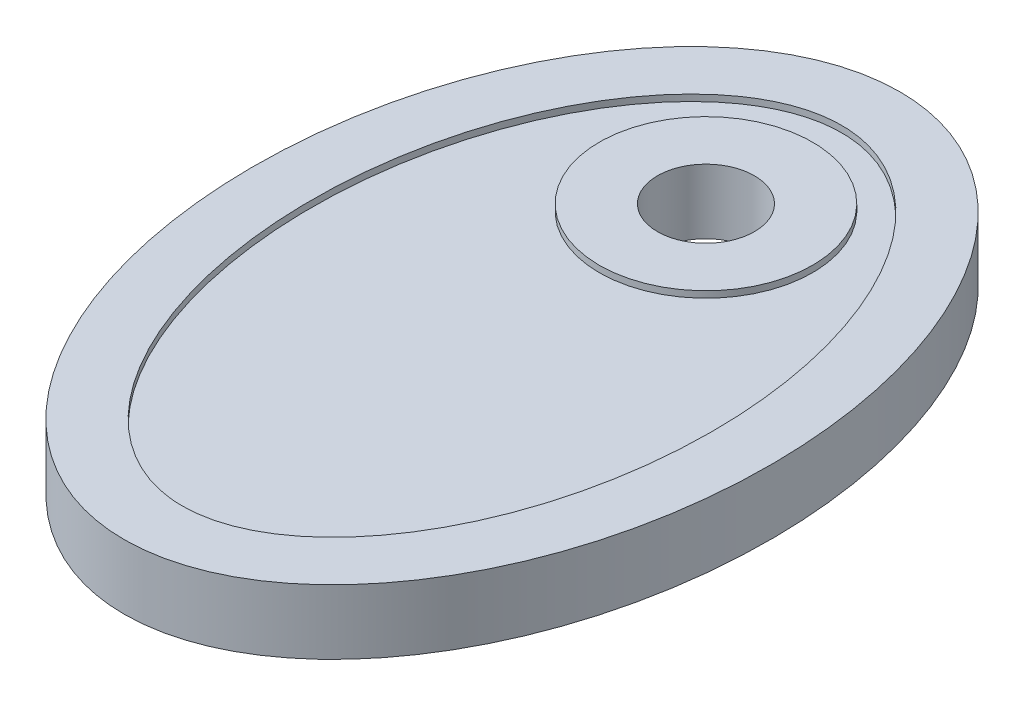
ISO-10303-21;
HEADER;
FILE_DESCRIPTION(('STEP AP214'),'2;1');
FILE_NAME('part.step','',(''),(''),'','','');
FILE_SCHEMA(('AUTOMOTIVE_DESIGN { 1 0 10303 214 1 1 1 1 }'));
ENDSEC;
DATA;
#1=APPLICATION_CONTEXT('core data for automotive mechanical design processes');
#2=APPLICATION_PROTOCOL_DEFINITION('international standard','automotive_design',2000,#1);
#3=PRODUCT_CONTEXT('',#1,'mechanical');
#4=PRODUCT('Part','Part','',(#3));
#5=PRODUCT_RELATED_PRODUCT_CATEGORY('part','',(#4));
#6=PRODUCT_DEFINITION_FORMATION('','',#4);
#7=PRODUCT_DEFINITION_CONTEXT('part definition',#1,'design');
#8=PRODUCT_DEFINITION('design','',#6,#7);
#9=PRODUCT_DEFINITION_SHAPE('','',#8);
#10=(LENGTH_UNIT() NAMED_UNIT(*) SI_UNIT(.MILLI.,.METRE.));
#11=(NAMED_UNIT(*) PLANE_ANGLE_UNIT() SI_UNIT($,.RADIAN.));
#12=(NAMED_UNIT(*) SI_UNIT($,.STERADIAN.) SOLID_ANGLE_UNIT());
#13=UNCERTAINTY_MEASURE_WITH_UNIT(LENGTH_MEASURE(1.E-05),#10,'distance_accuracy_value','');
#14=(GEOMETRIC_REPRESENTATION_CONTEXT(3) GLOBAL_UNCERTAINTY_ASSIGNED_CONTEXT((#13)) GLOBAL_UNIT_ASSIGNED_CONTEXT((#10,
#11,#12)) REPRESENTATION_CONTEXT('',''));
#15=CARTESIAN_POINT('',(0.,0.,0.));
#16=DIRECTION('',(0.,0.,1.));
#17=DIRECTION('',(1.,0.,0.));
#18=AXIS2_PLACEMENT_3D('',#15,#16,#17);
#19=CARTESIAN_POINT('',(0.,10.,0.));
#20=DIRECTION('',(0.,1.,0.));
#21=DIRECTION('',(0.,0.,1.));
#22=AXIS2_PLACEMENT_3D('',#19,#20,#21);
#23=PLANE('',#22);
#24=CARTESIAN_POINT('',(0.,10.,-30.));
#25=DIRECTION('',(0.,1.,0.));
#26=DIRECTION('',(0.,0.,1.));
#27=AXIS2_PLACEMENT_3D('',#24,#25,#26);
#28=CIRCLE('',#27,7.5);
#29=CARTESIAN_POINT('',(0.,10.,-22.5));
#30=VERTEX_POINT('',#29);
#31=EDGE_CURVE('E44',#30,#30,#28,.T.);
#32=ORIENTED_EDGE('',*,*,#31,.F.);
#33=EDGE_LOOP('',(#32));
#34=FACE_BOUND('',#33,.T.);
#35=CARTESIAN_POINT('',(0.,10.,-30.));
#36=DIRECTION('',(0.,1.,0.));
#37=DIRECTION('',(0.,0.,1.));
#38=AXIS2_PLACEMENT_3D('',#35,#36,#37);
#39=CIRCLE('',#38,16.5);
#40=CARTESIAN_POINT('',(0.,10.,-13.5));
#41=VERTEX_POINT('',#40);
#42=EDGE_CURVE('E84',#41,#41,#39,.T.);
#43=ORIENTED_EDGE('',*,*,#42,.T.);
#44=EDGE_LOOP('',(#43));
#45=FACE_BOUND('',#44,.T.);
#46=ADVANCED_FACE('F36',(#34,#45),#23,.T.);
#47=CARTESIAN_POINT('',(0.,10.,-30.));
#48=DIRECTION('',(0.,-1.,0.));
#49=DIRECTION('',(0.,0.,-1.));
#50=AXIS2_PLACEMENT_3D('',#47,#48,#49);
#51=CYLINDRICAL_SURFACE('',#50,7.5);
#52=ORIENTED_EDGE('',*,*,#31,.T.);
#53=EDGE_LOOP('',(#52));
#54=FACE_BOUND('',#53,.T.);
#55=CARTESIAN_POINT('',(0.,0.,-30.));
#56=DIRECTION('',(0.,1.,0.));
#57=DIRECTION('',(0.,0.,1.));
#58=AXIS2_PLACEMENT_3D('',#55,#56,#57);
#59=CIRCLE('',#58,7.5);
#60=CARTESIAN_POINT('',(0.,0.,-22.5));
#61=VERTEX_POINT('',#60);
#62=EDGE_CURVE('E52',#61,#61,#59,.T.);
#63=ORIENTED_EDGE('',*,*,#62,.F.);
#64=EDGE_LOOP('',(#63));
#65=FACE_BOUND('',#64,.T.);
#66=ADVANCED_FACE('F38',(#54,#65),#51,.F.);
#67=CARTESIAN_POINT('',(0.,10.,0.));
#68=DIRECTION('',(0.,1.,0.));
#69=DIRECTION('',(0.,0.,-1.));
#70=AXIS2_PLACEMENT_3D('',#67,#68,#69);
#71=ELLIPSE('',#70,60.,40.);
#72=DIRECTION('',(0.,-1.,0.));
#73=VECTOR('',#72,1.);
#74=SURFACE_OF_LINEAR_EXTRUSION('',#71,#73);
#75=CARTESIAN_POINT('',(0.,10.,-60.));
#76=VERTEX_POINT('',#75);
#77=EDGE_CURVE('E10',#76,#76,#71,.T.);
#78=ORIENTED_EDGE('',*,*,#77,.F.);
#79=EDGE_LOOP('',(#78));
#80=FACE_BOUND('',#79,.T.);
#81=CARTESIAN_POINT('',(0.,0.,0.));
#82=DIRECTION('',(0.,1.,0.));
#83=DIRECTION('',(0.,0.,-1.));
#84=AXIS2_PLACEMENT_3D('',#81,#82,#83);
#85=ELLIPSE('',#84,60.,40.);
#86=CARTESIAN_POINT('',(0.,0.,-60.));
#87=VERTEX_POINT('',#86);
#88=EDGE_CURVE('E40',#87,#87,#85,.T.);
#89=ORIENTED_EDGE('',*,*,#88,.T.);
#90=EDGE_LOOP('',(#89));
#91=FACE_BOUND('',#90,.T.);
#92=ADVANCED_FACE('F53',(#80,#91),#74,.F.);
#93=CARTESIAN_POINT('',(0.,10.,51.));
#94=CARTESIAN_POINT('',(0.363331942572548,10.,50.9999993472928));
#95=CARTESIAN_POINT('',(0.72667185661985,10.,50.9887785571514));
#96=CARTESIAN_POINT('',(1.45210004218176,10.,50.9440359100779));
#97=CARTESIAN_POINT('',(1.81418780996727,10.,50.9105059371893));
#98=CARTESIAN_POINT('',(2.53566862494331,10.,50.8215747320704));
#99=CARTESIAN_POINT('',(2.89506161295472,10.,50.7661730209477));
#100=CARTESIAN_POINT('',(3.61047862296689,10.,50.6340883392831));
#101=CARTESIAN_POINT('',(3.96649655070765,10.,50.5573724738923));
#102=CARTESIAN_POINT('',(4.67351232782389,10.,50.3835928276542));
#103=CARTESIAN_POINT('',(5.0245103352103,10.,50.286529688786));
#104=CARTESIAN_POINT('',(5.72056992262585,10.,50.0731081270343));
#105=CARTESIAN_POINT('',(6.0656311426587,10.,49.956748538568));
#106=CARTESIAN_POINT('',(7.03100448491029,10.,49.6023364137692));
#107=CARTESIAN_POINT('',(7.64363078343208,10.,49.3430630558093));
#108=CARTESIAN_POINT('',(8.84329116384838,10.,48.7711178583314));
#109=CARTESIAN_POINT('',(9.43031901453351,10.,48.4584331074183));
#110=CARTESIAN_POINT('',(10.5777374825332,10.,47.7861474631697));
#111=CARTESIAN_POINT('',(11.1380939210909,10.,47.4264884707071));
#112=CARTESIAN_POINT('',(12.2306187328155,10.,46.6668476638044));
#113=CARTESIAN_POINT('',(12.7627854631189,10.,46.2668635031954));
#114=CARTESIAN_POINT('',(14.0479675888981,10.,45.231420987286));
#115=CARTESIAN_POINT('',(14.7842614197669,10.,44.5751516631253));
#116=CARTESIAN_POINT('',(16.1968127572353,10.,43.2009115931968));
#117=CARTESIAN_POINT('',(16.873041804546,10.,42.4829119126975));
#118=CARTESIAN_POINT('',(18.1688024124558,10.,40.995824047029));
#119=CARTESIAN_POINT('',(18.788248790744,10.,40.2266619997508));
#120=CARTESIAN_POINT('',(19.9721569832936,10.,38.6473878786163));
#121=CARTESIAN_POINT('',(20.5366206161316,10.,37.837277160501));
#122=CARTESIAN_POINT('',(21.6406134525096,10.,36.1415722525619));
#123=CARTESIAN_POINT('',(22.1774510158127,10.,35.2542315910504));
#124=CARTESIAN_POINT('',(23.1969480930636,10.,33.4485305742953));
#125=CARTESIAN_POINT('',(23.6795815903968,10.,32.5301555961199));
#126=CARTESIAN_POINT('',(24.5932000691607,10.,30.6679756587652));
#127=CARTESIAN_POINT('',(25.0241771000918,10.,29.7241668123432));
#128=CARTESIAN_POINT('',(25.8373058869897,10.,27.8144376385049));
#129=CARTESIAN_POINT('',(26.2193966747139,10.,26.8484914382954));
#130=CARTESIAN_POINT('',(26.9361443908843,10.,24.8994378256087));
#131=CARTESIAN_POINT('',(27.2708115485805,10.,23.9163341655276));
#132=CARTESIAN_POINT('',(27.8946047335904,10.,21.935755585814));
#133=CARTESIAN_POINT('',(28.1837267994326,10.,20.9382794243008));
#134=CARTESIAN_POINT('',(28.8233647370208,10.,18.5354957094464));
#135=CARTESIAN_POINT('',(29.1530704336629,10.,17.124613230959));
#136=CARTESIAN_POINT('',(29.7300892901053,10.,14.2857662601995));
#137=CARTESIAN_POINT('',(29.9773757808812,10.,12.8577963933583));
#138=CARTESIAN_POINT('',(30.3918096156627,10.,9.99007688766845));
#139=CARTESIAN_POINT('',(30.5589443780295,10.,8.55032543548398));
#140=CARTESIAN_POINT('',(30.8148200588801,10.,5.66104971716649));
#141=CARTESIAN_POINT('',(30.9034060600109,10.,4.21151179479756));
#142=CARTESIAN_POINT('',(31.0024314418822,10.,1.31003393115168));
#143=CARTESIAN_POINT('',(31.0128845870751,10.,-0.141905541969763));
#144=CARTESIAN_POINT('',(30.9557777705272,10.,-3.04416572261065));
#145=CARTESIAN_POINT('',(30.8882224849586,10.,-4.49448652194429));
#146=CARTESIAN_POINT('',(30.6730339477902,10.,-7.40901534728054));
#147=CARTESIAN_POINT('',(30.5243255357497,10.,-8.87314444673375));
#148=CARTESIAN_POINT('',(30.1446951529756,10.,-11.790895039838));
#149=CARTESIAN_POINT('',(29.9137649463056,10.,-13.2445154659755));
#150=CARTESIAN_POINT('',(29.3673166763212,10.,-16.136518909521));
#151=CARTESIAN_POINT('',(29.0517613974943,10.,-17.5748949329126));
#152=CARTESIAN_POINT('',(28.3343246429404,10.,-20.4242040084431));
#153=CARTESIAN_POINT('',(27.9327757831459,10.,-21.8352205774013));
#154=CARTESIAN_POINT('',(27.038614511015,10.,-24.6278497669017));
#155=CARTESIAN_POINT('',(26.5460357363625,10.,-26.0094730393395));
#156=CARTESIAN_POINT('',(25.735207822477,10.,-28.0524775766029));
#157=CARTESIAN_POINT('',(25.4530552418181,10.,-28.7283314907416));
#158=CARTESIAN_POINT('',(24.8639156583644,10.,-30.0691084561957));
#159=CARTESIAN_POINT('',(24.5569301183144,10.,-30.734032148566));
#160=CARTESIAN_POINT('',(23.7945912309787,10.,-32.3040831228001));
#161=CARTESIAN_POINT('',(23.3274845196538,10.,-33.2035470795208));
#162=CARTESIAN_POINT('',(22.3416162916778,10.,-34.9736741814713));
#163=CARTESIAN_POINT('',(21.8228600659894,10.,-35.8443402645994));
#164=CARTESIAN_POINT('',(20.7309434498334,10.,-37.5507261140679));
#165=CARTESIAN_POINT('',(20.1577956451536,10.,-38.3864539006966));
#166=CARTESIAN_POINT('',(18.9539877045298,10.,-40.0154963989566));
#167=CARTESIAN_POINT('',(18.3233367862932,10.,-40.8088178760611));
#168=CARTESIAN_POINT('',(17.1293110547041,10.,-42.1949003071544));
#169=CARTESIAN_POINT('',(16.5765225640521,10.,-42.7967712434432));
#170=CARTESIAN_POINT('',(15.4299297456675,10.,-43.9603371488574));
#171=CARTESIAN_POINT('',(14.8361231159492,10.,-44.5220298595274));
#172=CARTESIAN_POINT('',(13.607051838476,10.,-45.5968005170026));
#173=CARTESIAN_POINT('',(12.971844246316,10.,-46.1099430755861));
#174=CARTESIAN_POINT('',(11.9875254443612,10.,-46.8364560728483));
#175=CARTESIAN_POINT('',(11.6542137793198,10.,-47.0713989143906));
#176=CARTESIAN_POINT('',(10.9769815895992,10.,-47.5256772473742));
#177=CARTESIAN_POINT('',(10.6330586329556,10.,-47.7450091223281));
#178=CARTESIAN_POINT('',(9.79700694321435,10.,-48.2497764954778));
#179=CARTESIAN_POINT('',(9.29995808512551,10.,-48.5271358884026));
#180=CARTESIAN_POINT('',(8.28677831997349,10.,-49.0442354258324));
#181=CARTESIAN_POINT('',(7.77065311929716,10.,-49.2839867094606));
#182=CARTESIAN_POINT('',(6.72127462084253,10.,-49.7213211689836));
#183=CARTESIAN_POINT('',(6.18803647298591,10.,-49.9189405202722));
#184=CARTESIAN_POINT('',(5.10645364533738,10.,-50.2678487180929));
#185=CARTESIAN_POINT('',(4.55810890720509,10.,-50.4191373856725));
#186=CARTESIAN_POINT('',(3.63132126324471,10.,-50.6301277865288));
#187=CARTESIAN_POINT('',(3.25596933801539,10.,-50.7036007188103));
#188=CARTESIAN_POINT('',(2.50134011463263,10.,-50.8268301092898));
#189=CARTESIAN_POINT('',(2.12206265258086,10.,-50.8765855731256));
#190=CARTESIAN_POINT('',(1.36111158428026,10.,-50.951660202295));
#191=CARTESIAN_POINT('',(0.979438086831125,10.,-50.9769804692238));
#192=CARTESIAN_POINT('',(0.215367896801231,10.,-51.0028172582333));
#193=CARTESIAN_POINT('',(-0.16702853417828,10.,-51.0033414859383));
#194=CARTESIAN_POINT('',(-0.931069827349889,10.,-50.979594357692));
#195=CARTESIAN_POINT('',(-1.31271465374765,10.,-50.9553218481288));
#196=CARTESIAN_POINT('',(-2.07358636777429,10.,-50.8823481958708));
#197=CARTESIAN_POINT('',(-2.4528135639682,10.,-50.833650236504));
#198=CARTESIAN_POINT('',(-3.32726958068449,10.,-50.6932574388235));
#199=CARTESIAN_POINT('',(-3.82111402982957,10.,-50.5928214652584));
#200=CARTESIAN_POINT('',(-4.79910272761887,10.,-50.3530029510269));
#201=CARTESIAN_POINT('',(-5.28324811870489,10.,-50.2136250265436));
#202=CARTESIAN_POINT('',(-6.23983655733434,10.,-49.8986571713203));
#203=CARTESIAN_POINT('',(-6.71227372290285,10.,-49.7230494366029));
#204=CARTESIAN_POINT('',(-7.64348258349103,10.,-49.3387344705799));
#205=CARTESIAN_POINT('',(-8.10225198280094,10.,-49.1300217155989));
#206=CARTESIAN_POINT('',(-9.21972378889298,10.,-48.5761065493043));
#207=CARTESIAN_POINT('',(-9.86969981998974,10.,-48.2132108003973));
#208=CARTESIAN_POINT('',(-11.1351125778756,10.,-47.4315116595368));
#209=CARTESIAN_POINT('',(-11.7505349418453,10.,-47.0126852598848));
#210=CARTESIAN_POINT('',(-12.947209232884,10.,-46.1267399566486));
#211=CARTESIAN_POINT('',(-13.5283943260411,10.,-45.6595312079359));
#212=CARTESIAN_POINT('',(-14.6556163461017,10.,-44.6846830561176));
#213=CARTESIAN_POINT('',(-15.2016532520394,10.,-44.1770436288954));
#214=CARTESIAN_POINT('',(-16.2714516970148,10.,-43.1154338534188));
#215=CARTESIAN_POINT('',(-16.7944262838627,10.,-42.5606734074284));
#216=CARTESIAN_POINT('',(-17.805940422262,10.,-41.4202606647794));
#217=CARTESIAN_POINT('',(-18.2944640629099,10.,-40.8345943099538));
#218=CARTESIAN_POINT('',(-19.2382048536272,10.,-39.6369590850471));
#219=CARTESIAN_POINT('',(-19.6934172280392,10.,-39.0249864634638));
#220=CARTESIAN_POINT('',(-20.5724622434377,10.,-37.7775679010778));
#221=CARTESIAN_POINT('',(-20.9962458649392,10.,-37.1420875163101));
#222=CARTESIAN_POINT('',(-21.812876974485,10.,-35.8517783796921));
#223=CARTESIAN_POINT('',(-22.2057309351078,10.,-35.1969537156305));
#224=CARTESIAN_POINT('',(-22.9618318630695,10.,-33.8704176993162));
#225=CARTESIAN_POINT('',(-23.3250762700109,10.,-33.1987048932694));
#226=CARTESIAN_POINT('',(-24.2164145504303,10.,-31.4644723174615));
#227=CARTESIAN_POINT('',(-24.7243801769513,10.,-30.3915592816379));
#228=CARTESIAN_POINT('',(-25.6754072076747,10.,-28.2169595697744));
#229=CARTESIAN_POINT('',(-26.1184385082247,10.,-27.115259825291));
#230=CARTESIAN_POINT('',(-26.9426060955216,10.,-24.8887890626142));
#231=CARTESIAN_POINT('',(-27.3237314358728,10.,-23.7640140036917));
#232=CARTESIAN_POINT('',(-28.0268960632185,10.,-21.4952842188249));
#233=CARTESIAN_POINT('',(-28.3488904342569,10.,-20.3513156273848));
#234=CARTESIAN_POINT('',(-28.9355507436623,10.,-18.0490846351105));
#235=CARTESIAN_POINT('',(-29.2002299012277,10.,-16.8908255955078));
#236=CARTESIAN_POINT('',(-29.6740687689371,10.,-14.5631162778503));
#237=CARTESIAN_POINT('',(-29.8832296047148,10.,-13.3936662271914));
#238=CARTESIAN_POINT('',(-30.3502634739202,10.,-10.3834755233569));
#239=CARTESIAN_POINT('',(-30.5689578922717,10.,-8.5365365540388));
#240=CARTESIAN_POINT('',(-30.8771840635331,10.,-4.83197086294974));
#241=CARTESIAN_POINT('',(-30.9667054030674,10.,-2.97434329162818));
#242=CARTESIAN_POINT('',(-31.0179266385518,10.,0.743053428649654));
#243=CARTESIAN_POINT('',(-30.9795998373578,10.,2.60282294382357));
#244=CARTESIAN_POINT('',(-30.7744819803157,10.,6.3153048570326));
#245=CARTESIAN_POINT('',(-30.6076998687877,10.,8.16801773739396));
#246=CARTESIAN_POINT('',(-30.2231034830499,10.,11.2219543200852));
#247=CARTESIAN_POINT('',(-30.0425969142509,10.,12.4279863322839));
#248=CARTESIAN_POINT('',(-29.6239841336532,10.,14.8301352739046));
#249=CARTESIAN_POINT('',(-29.3858760218547,10.,16.0262518749183));
#250=CARTESIAN_POINT('',(-28.8503919778835,10.,18.4054698174184));
#251=CARTESIAN_POINT('',(-28.5530021012607,10.,19.5885680274551));
#252=CARTESIAN_POINT('',(-27.8973832275134,10.,21.9359856670917));
#253=CARTESIAN_POINT('',(-27.5392438358566,10.,23.1003300281769));
#254=CARTESIAN_POINT('',(-26.759324691918,10.,25.4073394548355));
#255=CARTESIAN_POINT('',(-26.3375568074402,10.,26.550008518575));
#256=CARTESIAN_POINT('',(-25.4274151749414,10.,28.8079891817891));
#257=CARTESIAN_POINT('',(-24.9390745202342,10.,29.9233140510784));
#258=CARTESIAN_POINT('',(-23.9520634515701,10.,31.9942641142835));
#259=CARTESIAN_POINT('',(-23.4610218828995,10.,32.9535183072326));
#260=CARTESIAN_POINT('',(-22.4207220003277,10.,34.840004275695));
#261=CARTESIAN_POINT('',(-21.871465293396,10.,35.767236934194));
#262=CARTESIAN_POINT('',(-20.7116783133223,10.,37.581949339956));
#263=CARTESIAN_POINT('',(-20.1011933435269,10.,38.469457786485));
#264=CARTESIAN_POINT('',(-19.1367643289502,10.,39.7641624219377));
#265=CARTESIAN_POINT('',(-18.8071825544881,10.,40.189624408691));
#266=CARTESIAN_POINT('',(-18.1312711828154,10.,41.0270167949873));
#267=CARTESIAN_POINT('',(-17.7849421292975,10.,41.4389476330847));
#268=CARTESIAN_POINT('',(-16.9105618449079,10.,42.4351389415809));
#269=CARTESIAN_POINT('',(-16.3726418352262,10.,43.0108431457224));
#270=CARTESIAN_POINT('',(-15.537255206338,10.,43.8456532033587));
#271=CARTESIAN_POINT('',(-15.254042523676,10.,44.1191316329407));
#272=CARTESIAN_POINT('',(-14.6778272457558,10.,44.6557986146888));
#273=CARTESIAN_POINT('',(-14.3848209503191,10.,44.9189831942853));
#274=CARTESIAN_POINT('',(-13.491829701015,10.,45.690930776633));
#275=CARTESIAN_POINT('',(-12.8770973296555,10.,46.182867802951));
#276=CARTESIAN_POINT('',(-11.6082372969767,10.,47.1130467538648));
#277=CARTESIAN_POINT('',(-10.9541195710931,10.,47.5513021363664));
#278=CARTESIAN_POINT('',(-9.79096277581307,10.,48.2533276535769));
#279=CARTESIAN_POINT('',(-9.29096497667715,10.,48.5321009418149));
#280=CARTESIAN_POINT('',(-8.27148920441843,10.,49.0516544897923));
#281=CARTESIAN_POINT('',(-7.75201162657699,10.,49.2924355199502));
#282=CARTESIAN_POINT('',(-6.69640707623667,10.,49.7309774612206));
#283=CARTESIAN_POINT('',(-6.16031704611177,10.,49.928826955781));
#284=CARTESIAN_POINT('',(-5.07313172634405,10.,50.277600160746));
#285=CARTESIAN_POINT('',(-4.52204229227905,10.,50.4285419054934));
#286=CARTESIAN_POINT('',(-3.64025778718893,10.,50.6273271854043));
#287=CARTESIAN_POINT('',(-3.31326685332761,10.,50.6919364196601));
#288=CARTESIAN_POINT('',(-2.65625784703452,10.,50.8031972892926));
#289=CARTESIAN_POINT('',(-2.32624017626918,10.,50.8498512731229));
#290=CARTESIAN_POINT('',(-1.6640253077511,10.,50.9247171454666));
#291=CARTESIAN_POINT('',(-1.33182752439415,10.,50.9529238553314));
#292=CARTESIAN_POINT('',(-0.666421950542,10.,50.9905641017271));
#293=CARTESIAN_POINT('',(-0.333214327617119,10.,51.0000005986024));
#294=CARTESIAN_POINT('',(0.,10.,51.));
#295=B_SPLINE_CURVE_WITH_KNOTS('',3,(#93,#94,#95,#96,#97,#98,#99,#100,#101,#102,#103,#104,#105,
#106,#107,#108,#109,#110,#111,#112,#113,#114,#115,#116,#117,#118,#119,#120,#121,#122,#123,#124,
#125,#126,#127,#128,#129,#130,#131,#132,#133,#134,#135,#136,#137,#138,#139,#140,#141,#142,#143,
#144,#145,#146,#147,#148,#149,#150,#151,#152,#153,#154,#155,#156,#157,#158,#159,#160,#161,#162,
#163,#164,#165,#166,#167,#168,#169,#170,#171,#172,#173,#174,#175,#176,#177,#178,#179,#180,#181,
#182,#183,#184,#185,#186,#187,#188,#189,#190,#191,#192,#193,#194,#195,#196,#197,#198,#199,#200,
#201,#202,#203,#204,#205,#206,#207,#208,#209,#210,#211,#212,#213,#214,#215,#216,#217,#218,#219,
#220,#221,#222,#223,#224,#225,#226,#227,#228,#229,#230,#231,#232,#233,#234,#235,#236,#237,#238,
#239,#240,#241,#242,#243,#244,#245,#246,#247,#248,#249,#250,#251,#252,#253,#254,#255,#256,#257,
#258,#259,#260,#261,#262,#263,#264,#265,#266,#267,#268,#269,#270,#271,#272,#273,#274,#275,#276,
#277,#278,#279,#280,#281,#282,#283,#284,#285,#286,#287,#288,#289,#290,#291,#292,#293,#294),
.UNSPECIFIED.,.T.,.F.,(4,2,2,2,2,2,2,2,2,2,2,2,2,2,2,2,2,2,2,2,2,2,2,2,2,2,2,2,2,2,2,2,2,2,2,2,
2,2,2,2,2,2,2,2,2,2,2,2,2,2,2,2,2,2,2,2,2,2,2,2,2,2,2,2,2,2,2,2,2,2,2,2,2,2,2,2,2,2,2,2,2,2,2,2,
2,2,2,2,2,2,2,2,2,2,2,2,2,2,2,2,4),(0.,1.08983767183651,2.18007203748872,3.27033027568293,
4.36228058333842,5.45419644393048,6.54617828465185,8.53871280866407,10.5317296811245,
12.5272353415096,14.5228571699939,17.4771867969358,20.4329088296322,23.3929946967083,
26.3529826244782,29.4621943455425,32.5728920906377,35.6840679932835,38.7990869272313,
41.9134329272459,45.028049660911,49.3720156233086,53.7173858350673,58.0634379285423,
62.4180425550636,66.7718800246639,71.1254565194398,75.538163483724,79.9513125814274,
84.3664056384301,88.7647203582244,93.1614130358944,95.3581482884265,97.5547542399483,
100.593673713334,103.632282200279,106.670189283349,109.707610245372,112.157440448821,
114.607408251462,117.054068309797,118.277077172051,119.500368444507,121.206468912328,
122.912063093214,124.616186862759,126.320317214411,127.467062194713,128.613855248421,
129.760596599632,130.906981586828,132.053419909406,133.199708857407,134.709819739523,
136.219751688827,137.730427420731,139.241355479237,141.471155628981,143.701875873814,
145.936815445889,148.171756351096,150.457427280925,152.744147009105,155.031193932336,
157.321736051574,159.611797553192,161.902056871411,165.460824202531,169.021236200195,
172.582277076747,176.146011835454,179.70892377577,183.271763472548,188.84630905264,
194.421304003411,199.997463192934,205.573234150598,209.230391266394,212.887669030789,
216.545808089292,220.198597583887,223.850706611065,227.501006750788,230.732040001994,
233.962984087038,237.19155496071,238.805735591655,240.419863854113,242.78163969922,
243.962522624892,245.143856864854,247.503234402175,249.862019231279,251.578003121687,
253.293952210376,255.00632627214,256.718041170851,257.717547124316,258.716922303126,
259.716577913288,260.716075850248),.UNSPECIFIED.);
#296=CARTESIAN_POINT('',(0.,10.,51.));
#297=VERTEX_POINT('',#296);
#298=EDGE_CURVE('E88',#297,#297,#295,.T.);
#299=ORIENTED_EDGE('',*,*,#298,.F.);
#300=EDGE_LOOP('',(#299));
#301=FACE_BOUND('',#300,.T.);
#302=ORIENTED_EDGE('',*,*,#77,.T.);
#303=EDGE_LOOP('',(#302));
#304=FACE_BOUND('',#303,.T.);
#305=ADVANCED_FACE('F56',(#301,#304),#23,.T.);
#306=CARTESIAN_POINT('',(0.,0.,0.));
#307=DIRECTION('',(0.,1.,0.));
#308=DIRECTION('',(0.,0.,1.));
#309=AXIS2_PLACEMENT_3D('',#306,#307,#308);
#310=PLANE('',#309);
#311=ORIENTED_EDGE('',*,*,#62,.T.);
#312=EDGE_LOOP('',(#311));
#313=FACE_BOUND('',#312,.T.);
#314=ORIENTED_EDGE('',*,*,#88,.F.);
#315=EDGE_LOOP('',(#314));
#316=FACE_BOUND('',#315,.T.);
#317=ADVANCED_FACE('F58',(#313,#316),#310,.F.);
#318=CARTESIAN_POINT('',(0.,10.,-30.));
#319=DIRECTION('',(0.,-1.,0.));
#320=DIRECTION('',(0.,0.,-1.));
#321=AXIS2_PLACEMENT_3D('',#318,#319,#320);
#322=CYLINDRICAL_SURFACE('',#321,16.5);
#323=ORIENTED_EDGE('',*,*,#42,.F.);
#324=EDGE_LOOP('',(#323));
#325=FACE_BOUND('',#324,.T.);
#326=CARTESIAN_POINT('',(0.,9.,-30.));
#327=DIRECTION('',(0.,1.,0.));
#328=DIRECTION('',(0.,0.,1.));
#329=AXIS2_PLACEMENT_3D('',#326,#327,#328);
#330=CIRCLE('',#329,16.5);
#331=CARTESIAN_POINT('',(0.,9.,-13.5));
#332=VERTEX_POINT('',#331);
#333=EDGE_CURVE('E85',#332,#332,#330,.T.);
#334=ORIENTED_EDGE('',*,*,#333,.T.);
#335=EDGE_LOOP('',(#334));
#336=FACE_BOUND('',#335,.T.);
#337=ADVANCED_FACE('F61',(#325,#336),#322,.T.);
#338=CARTESIAN_POINT('',(0.,10.,0.));
#339=DIRECTION('',(0.,1.,0.));
#340=DIRECTION('',(0.,0.,-1.));
#341=AXIS2_PLACEMENT_3D('',#338,#339,#340);
#342=ELLIPSE('',#341,60.,40.);
#343=DIRECTION('',(0.,-1.,0.));
#344=VECTOR('',#343,1.);
#345=SURFACE_OF_LINEAR_EXTRUSION('',#342,#344);
#346=OFFSET_SURFACE('',#345,9.,.F.);
#347=ORIENTED_EDGE('',*,*,#298,.T.);
#348=EDGE_LOOP('',(#347));
#349=FACE_BOUND('',#348,.T.);
#350=CARTESIAN_POINT('',(0.,9.,51.));
#351=CARTESIAN_POINT('',(0.363331942572548,9.,50.9999993472928));
#352=CARTESIAN_POINT('',(0.72667185661985,9.,50.9887785571514));
#353=CARTESIAN_POINT('',(1.45210004218176,9.,50.9440359100779));
#354=CARTESIAN_POINT('',(1.81418780996727,9.,50.9105059371893));
#355=CARTESIAN_POINT('',(2.53566862494331,9.,50.8215747320704));
#356=CARTESIAN_POINT('',(2.89506161295472,9.,50.7661730209477));
#357=CARTESIAN_POINT('',(3.61047862296689,9.,50.6340883392831));
#358=CARTESIAN_POINT('',(3.96649655070765,9.,50.5573724738923));
#359=CARTESIAN_POINT('',(4.67351232782389,9.,50.3835928276542));
#360=CARTESIAN_POINT('',(5.0245103352103,9.,50.286529688786));
#361=CARTESIAN_POINT('',(5.72056992262585,9.,50.0731081270343));
#362=CARTESIAN_POINT('',(6.0656311426587,9.,49.956748538568));
#363=CARTESIAN_POINT('',(7.03100448491029,9.,49.6023364137692));
#364=CARTESIAN_POINT('',(7.64363078343208,9.,49.3430630558093));
#365=CARTESIAN_POINT('',(8.84329116384838,9.,48.7711178583314));
#366=CARTESIAN_POINT('',(9.43031901453351,9.,48.4584331074183));
#367=CARTESIAN_POINT('',(10.5777374825332,9.,47.7861474631697));
#368=CARTESIAN_POINT('',(11.1380939210909,9.,47.4264884707071));
#369=CARTESIAN_POINT('',(12.2306187328155,9.,46.6668476638044));
#370=CARTESIAN_POINT('',(12.7627854631189,9.,46.2668635031954));
#371=CARTESIAN_POINT('',(14.0479675888981,9.,45.231420987286));
#372=CARTESIAN_POINT('',(14.7842614197669,9.,44.5751516631253));
#373=CARTESIAN_POINT('',(16.1968127572353,9.,43.2009115931968));
#374=CARTESIAN_POINT('',(16.873041804546,9.,42.4829119126975));
#375=CARTESIAN_POINT('',(18.1688024124558,9.,40.995824047029));
#376=CARTESIAN_POINT('',(18.788248790744,9.,40.2266619997508));
#377=CARTESIAN_POINT('',(19.9721569832936,9.,38.6473878786163));
#378=CARTESIAN_POINT('',(20.5366206161316,9.,37.837277160501));
#379=CARTESIAN_POINT('',(21.6406134525096,9.,36.1415722525619));
#380=CARTESIAN_POINT('',(22.1774510158127,9.,35.2542315910504));
#381=CARTESIAN_POINT('',(23.1969480930636,9.,33.4485305742953));
#382=CARTESIAN_POINT('',(23.6795815903968,9.,32.5301555961199));
#383=CARTESIAN_POINT('',(24.5932000691607,9.,30.6679756587652));
#384=CARTESIAN_POINT('',(25.0241771000918,9.,29.7241668123432));
#385=CARTESIAN_POINT('',(25.8373058869897,9.,27.8144376385049));
#386=CARTESIAN_POINT('',(26.2193966747139,9.,26.8484914382954));
#387=CARTESIAN_POINT('',(26.9361443908843,9.,24.8994378256087));
#388=CARTESIAN_POINT('',(27.2708115485805,9.,23.9163341655276));
#389=CARTESIAN_POINT('',(27.8946047335904,9.,21.935755585814));
#390=CARTESIAN_POINT('',(28.1837267994326,9.,20.9382794243008));
#391=CARTESIAN_POINT('',(28.8233647370208,9.,18.5354957094464));
#392=CARTESIAN_POINT('',(29.1530704336629,9.,17.124613230959));
#393=CARTESIAN_POINT('',(29.7300892901053,9.,14.2857662601995));
#394=CARTESIAN_POINT('',(29.9773757808812,9.,12.8577963933583));
#395=CARTESIAN_POINT('',(30.3918096156627,9.,9.99007688766845));
#396=CARTESIAN_POINT('',(30.5589443780295,9.,8.55032543548398));
#397=CARTESIAN_POINT('',(30.8148200588801,9.,5.66104971716649));
#398=CARTESIAN_POINT('',(30.9034060600109,9.,4.21151179479756));
#399=CARTESIAN_POINT('',(31.0024314418822,9.,1.31003393115168));
#400=CARTESIAN_POINT('',(31.0128845870751,9.,-0.141905541969763));
#401=CARTESIAN_POINT('',(30.9557777705272,9.,-3.04416572261065));
#402=CARTESIAN_POINT('',(30.8882224849586,9.,-4.49448652194429));
#403=CARTESIAN_POINT('',(30.6730339477902,9.,-7.40901534728054));
#404=CARTESIAN_POINT('',(30.5243255357497,9.,-8.87314444673375));
#405=CARTESIAN_POINT('',(30.1446951529756,9.,-11.790895039838));
#406=CARTESIAN_POINT('',(29.9137649463056,9.,-13.2445154659755));
#407=CARTESIAN_POINT('',(29.3673166763212,9.,-16.136518909521));
#408=CARTESIAN_POINT('',(29.0517613974943,9.,-17.5748949329126));
#409=CARTESIAN_POINT('',(28.3343246429404,9.,-20.4242040084431));
#410=CARTESIAN_POINT('',(27.9327757831459,9.,-21.8352205774013));
#411=CARTESIAN_POINT('',(27.038614511015,9.,-24.6278497669017));
#412=CARTESIAN_POINT('',(26.5460357363625,9.,-26.0094730393395));
#413=CARTESIAN_POINT('',(25.735207822477,9.,-28.0524775766029));
#414=CARTESIAN_POINT('',(25.4530552418181,9.,-28.7283314907416));
#415=CARTESIAN_POINT('',(24.8639156583644,9.,-30.0691084561957));
#416=CARTESIAN_POINT('',(24.5569301183144,9.,-30.734032148566));
#417=CARTESIAN_POINT('',(23.7945912309787,9.,-32.3040831228001));
#418=CARTESIAN_POINT('',(23.3274845196538,9.,-33.2035470795208));
#419=CARTESIAN_POINT('',(22.3416162916778,9.,-34.9736741814713));
#420=CARTESIAN_POINT('',(21.8228600659894,9.,-35.8443402645994));
#421=CARTESIAN_POINT('',(20.7309434498334,9.,-37.5507261140679));
#422=CARTESIAN_POINT('',(20.1577956451536,9.,-38.3864539006966));
#423=CARTESIAN_POINT('',(18.9539877045298,9.,-40.0154963989566));
#424=CARTESIAN_POINT('',(18.3233367862932,9.,-40.8088178760611));
#425=CARTESIAN_POINT('',(17.1293110547041,9.,-42.1949003071544));
#426=CARTESIAN_POINT('',(16.5765225640521,9.,-42.7967712434432));
#427=CARTESIAN_POINT('',(15.4299297456675,9.,-43.9603371488574));
#428=CARTESIAN_POINT('',(14.8361231159492,9.,-44.5220298595274));
#429=CARTESIAN_POINT('',(13.607051838476,9.,-45.5968005170026));
#430=CARTESIAN_POINT('',(12.971844246316,9.,-46.1099430755861));
#431=CARTESIAN_POINT('',(11.9875254443612,9.,-46.8364560728483));
#432=CARTESIAN_POINT('',(11.6542137793198,9.,-47.0713989143906));
#433=CARTESIAN_POINT('',(10.9769815895992,9.,-47.5256772473742));
#434=CARTESIAN_POINT('',(10.6330586329556,9.,-47.7450091223281));
#435=CARTESIAN_POINT('',(9.79700694321435,9.,-48.2497764954778));
#436=CARTESIAN_POINT('',(9.29995808512551,9.,-48.5271358884026));
#437=CARTESIAN_POINT('',(8.28677831997349,9.,-49.0442354258324));
#438=CARTESIAN_POINT('',(7.77065311929716,9.,-49.2839867094606));
#439=CARTESIAN_POINT('',(6.72127462084253,9.,-49.7213211689836));
#440=CARTESIAN_POINT('',(6.18803647298591,9.,-49.9189405202722));
#441=CARTESIAN_POINT('',(5.10645364533738,9.,-50.2678487180929));
#442=CARTESIAN_POINT('',(4.55810890720509,9.,-50.4191373856725));
#443=CARTESIAN_POINT('',(3.63132126324471,9.,-50.6301277865288));
#444=CARTESIAN_POINT('',(3.25596933801539,9.,-50.7036007188103));
#445=CARTESIAN_POINT('',(2.50134011463263,9.,-50.8268301092898));
#446=CARTESIAN_POINT('',(2.12206265258086,9.,-50.8765855731256));
#447=CARTESIAN_POINT('',(1.36111158428026,9.,-50.951660202295));
#448=CARTESIAN_POINT('',(0.979438086831125,9.,-50.9769804692238));
#449=CARTESIAN_POINT('',(0.215367896801231,9.,-51.0028172582333));
#450=CARTESIAN_POINT('',(-0.16702853417828,9.,-51.0033414859383));
#451=CARTESIAN_POINT('',(-0.931069827349889,9.,-50.979594357692));
#452=CARTESIAN_POINT('',(-1.31271465374765,9.,-50.9553218481288));
#453=CARTESIAN_POINT('',(-2.07358636777429,9.,-50.8823481958708));
#454=CARTESIAN_POINT('',(-2.4528135639682,9.,-50.833650236504));
#455=CARTESIAN_POINT('',(-3.32726958068449,9.,-50.6932574388235));
#456=CARTESIAN_POINT('',(-3.82111402982957,9.,-50.5928214652584));
#457=CARTESIAN_POINT('',(-4.79910272761887,9.,-50.3530029510269));
#458=CARTESIAN_POINT('',(-5.28324811870489,9.,-50.2136250265436));
#459=CARTESIAN_POINT('',(-6.23983655733434,9.,-49.8986571713203));
#460=CARTESIAN_POINT('',(-6.71227372290285,9.,-49.7230494366029));
#461=CARTESIAN_POINT('',(-7.64348258349103,9.,-49.3387344705799));
#462=CARTESIAN_POINT('',(-8.10225198280094,9.,-49.1300217155989));
#463=CARTESIAN_POINT('',(-9.21972378889298,9.,-48.5761065493043));
#464=CARTESIAN_POINT('',(-9.86969981998974,9.,-48.2132108003973));
#465=CARTESIAN_POINT('',(-11.1351125778756,9.,-47.4315116595368));
#466=CARTESIAN_POINT('',(-11.7505349418453,9.,-47.0126852598848));
#467=CARTESIAN_POINT('',(-12.947209232884,9.,-46.1267399566486));
#468=CARTESIAN_POINT('',(-13.5283943260411,9.,-45.6595312079359));
#469=CARTESIAN_POINT('',(-14.6556163461017,9.,-44.6846830561176));
#470=CARTESIAN_POINT('',(-15.2016532520394,9.,-44.1770436288954));
#471=CARTESIAN_POINT('',(-16.2714516970148,9.,-43.1154338534188));
#472=CARTESIAN_POINT('',(-16.7944262838627,9.,-42.5606734074284));
#473=CARTESIAN_POINT('',(-17.805940422262,9.,-41.4202606647794));
#474=CARTESIAN_POINT('',(-18.2944640629099,9.,-40.8345943099538));
#475=CARTESIAN_POINT('',(-19.2382048536272,9.,-39.6369590850471));
#476=CARTESIAN_POINT('',(-19.6934172280392,9.,-39.0249864634638));
#477=CARTESIAN_POINT('',(-20.5724622434377,9.,-37.7775679010778));
#478=CARTESIAN_POINT('',(-20.9962458649392,9.,-37.1420875163101));
#479=CARTESIAN_POINT('',(-21.812876974485,9.,-35.8517783796921));
#480=CARTESIAN_POINT('',(-22.2057309351078,9.,-35.1969537156305));
#481=CARTESIAN_POINT('',(-22.9618318630695,9.,-33.8704176993162));
#482=CARTESIAN_POINT('',(-23.3250762700109,9.,-33.1987048932694));
#483=CARTESIAN_POINT('',(-24.2164145504303,9.,-31.4644723174615));
#484=CARTESIAN_POINT('',(-24.7243801769513,9.,-30.3915592816379));
#485=CARTESIAN_POINT('',(-25.6754072076747,9.,-28.2169595697744));
#486=CARTESIAN_POINT('',(-26.1184385082247,9.,-27.115259825291));
#487=CARTESIAN_POINT('',(-26.9426060955216,9.,-24.8887890626142));
#488=CARTESIAN_POINT('',(-27.3237314358728,9.,-23.7640140036917));
#489=CARTESIAN_POINT('',(-28.0268960632185,9.,-21.4952842188249));
#490=CARTESIAN_POINT('',(-28.3488904342569,9.,-20.3513156273848));
#491=CARTESIAN_POINT('',(-28.9355507436623,9.,-18.0490846351105));
#492=CARTESIAN_POINT('',(-29.2002299012277,9.,-16.8908255955078));
#493=CARTESIAN_POINT('',(-29.6740687689371,9.,-14.5631162778503));
#494=CARTESIAN_POINT('',(-29.8832296047148,9.,-13.3936662271914));
#495=CARTESIAN_POINT('',(-30.3502634739202,9.,-10.3834755233569));
#496=CARTESIAN_POINT('',(-30.5689578922717,9.,-8.5365365540388));
#497=CARTESIAN_POINT('',(-30.8771840635331,9.,-4.83197086294974));
#498=CARTESIAN_POINT('',(-30.9667054030674,9.,-2.97434329162818));
#499=CARTESIAN_POINT('',(-31.0179266385518,9.,0.743053428649654));
#500=CARTESIAN_POINT('',(-30.9795998373578,9.,2.60282294382357));
#501=CARTESIAN_POINT('',(-30.7744819803157,9.,6.3153048570326));
#502=CARTESIAN_POINT('',(-30.6076998687877,9.,8.16801773739396));
#503=CARTESIAN_POINT('',(-30.2231034830499,9.,11.2219543200852));
#504=CARTESIAN_POINT('',(-30.0425969142509,9.,12.4279863322839));
#505=CARTESIAN_POINT('',(-29.6239841336532,9.,14.8301352739046));
#506=CARTESIAN_POINT('',(-29.3858760218547,9.,16.0262518749183));
#507=CARTESIAN_POINT('',(-28.8503919778835,9.,18.4054698174184));
#508=CARTESIAN_POINT('',(-28.5530021012607,9.,19.5885680274551));
#509=CARTESIAN_POINT('',(-27.8973832275134,9.,21.9359856670917));
#510=CARTESIAN_POINT('',(-27.5392438358566,9.,23.1003300281769));
#511=CARTESIAN_POINT('',(-26.759324691918,9.,25.4073394548355));
#512=CARTESIAN_POINT('',(-26.3375568074402,9.,26.550008518575));
#513=CARTESIAN_POINT('',(-25.4274151749414,9.,28.8079891817891));
#514=CARTESIAN_POINT('',(-24.9390745202342,9.,29.9233140510784));
#515=CARTESIAN_POINT('',(-23.9520634515701,9.,31.9942641142835));
#516=CARTESIAN_POINT('',(-23.4610218828995,9.,32.9535183072326));
#517=CARTESIAN_POINT('',(-22.4207220003277,9.,34.840004275695));
#518=CARTESIAN_POINT('',(-21.871465293396,9.,35.767236934194));
#519=CARTESIAN_POINT('',(-20.7116783133223,9.,37.581949339956));
#520=CARTESIAN_POINT('',(-20.1011933435269,9.,38.469457786485));
#521=CARTESIAN_POINT('',(-19.1367643289502,9.,39.7641624219377));
#522=CARTESIAN_POINT('',(-18.8071825544881,9.,40.189624408691));
#523=CARTESIAN_POINT('',(-18.1312711828154,9.,41.0270167949873));
#524=CARTESIAN_POINT('',(-17.7849421292975,9.,41.4389476330847));
#525=CARTESIAN_POINT('',(-16.9105618449079,9.,42.4351389415809));
#526=CARTESIAN_POINT('',(-16.3726418352262,9.,43.0108431457224));
#527=CARTESIAN_POINT('',(-15.537255206338,9.,43.8456532033587));
#528=CARTESIAN_POINT('',(-15.254042523676,9.,44.1191316329407));
#529=CARTESIAN_POINT('',(-14.6778272457558,9.,44.6557986146888));
#530=CARTESIAN_POINT('',(-14.3848209503191,9.,44.9189831942853));
#531=CARTESIAN_POINT('',(-13.491829701015,9.,45.690930776633));
#532=CARTESIAN_POINT('',(-12.8770973296555,9.,46.182867802951));
#533=CARTESIAN_POINT('',(-11.6082372969767,9.,47.1130467538648));
#534=CARTESIAN_POINT('',(-10.9541195710931,9.,47.5513021363664));
#535=CARTESIAN_POINT('',(-9.79096277581307,9.,48.2533276535769));
#536=CARTESIAN_POINT('',(-9.29096497667715,9.,48.5321009418149));
#537=CARTESIAN_POINT('',(-8.27148920441843,9.,49.0516544897923));
#538=CARTESIAN_POINT('',(-7.75201162657699,9.,49.2924355199502));
#539=CARTESIAN_POINT('',(-6.69640707623667,9.,49.7309774612206));
#540=CARTESIAN_POINT('',(-6.16031704611177,9.,49.928826955781));
#541=CARTESIAN_POINT('',(-5.07313172634405,9.,50.277600160746));
#542=CARTESIAN_POINT('',(-4.52204229227905,9.,50.4285419054934));
#543=CARTESIAN_POINT('',(-3.64025778718893,9.,50.6273271854043));
#544=CARTESIAN_POINT('',(-3.31326685332761,9.,50.6919364196601));
#545=CARTESIAN_POINT('',(-2.65625784703452,9.,50.8031972892926));
#546=CARTESIAN_POINT('',(-2.32624017626918,9.,50.8498512731229));
#547=CARTESIAN_POINT('',(-1.6640253077511,9.,50.9247171454666));
#548=CARTESIAN_POINT('',(-1.33182752439415,9.,50.9529238553314));
#549=CARTESIAN_POINT('',(-0.666421950542,9.,50.9905641017271));
#550=CARTESIAN_POINT('',(-0.333214327617119,9.,51.0000005986024));
#551=CARTESIAN_POINT('',(0.,9.,51.));
#552=B_SPLINE_CURVE_WITH_KNOTS('',3,(#350,#351,#352,#353,#354,#355,#356,#357,#358,#359,#360,
#361,#362,#363,#364,#365,#366,#367,#368,#369,#370,#371,#372,#373,#374,#375,#376,#377,#378,#379,
#380,#381,#382,#383,#384,#385,#386,#387,#388,#389,#390,#391,#392,#393,#394,#395,#396,#397,#398,
#399,#400,#401,#402,#403,#404,#405,#406,#407,#408,#409,#410,#411,#412,#413,#414,#415,#416,#417,
#418,#419,#420,#421,#422,#423,#424,#425,#426,#427,#428,#429,#430,#431,#432,#433,#434,#435,#436,
#437,#438,#439,#440,#441,#442,#443,#444,#445,#446,#447,#448,#449,#450,#451,#452,#453,#454,#455,
#456,#457,#458,#459,#460,#461,#462,#463,#464,#465,#466,#467,#468,#469,#470,#471,#472,#473,#474,
#475,#476,#477,#478,#479,#480,#481,#482,#483,#484,#485,#486,#487,#488,#489,#490,#491,#492,#493,
#494,#495,#496,#497,#498,#499,#500,#501,#502,#503,#504,#505,#506,#507,#508,#509,#510,#511,#512,
#513,#514,#515,#516,#517,#518,#519,#520,#521,#522,#523,#524,#525,#526,#527,#528,#529,#530,#531,
#532,#533,#534,#535,#536,#537,#538,#539,#540,#541,#542,#543,#544,#545,#546,#547,#548,#549,#550,
#551),.UNSPECIFIED.,.T.,.F.,(4,2,2,2,2,2,2,2,2,2,2,2,2,2,2,2,2,2,2,2,2,2,2,2,2,2,2,2,2,2,2,2,2,
2,2,2,2,2,2,2,2,2,2,2,2,2,2,2,2,2,2,2,2,2,2,2,2,2,2,2,2,2,2,2,2,2,2,2,2,2,2,2,2,2,2,2,2,2,2,2,2,
2,2,2,2,2,2,2,2,2,2,2,2,2,2,2,2,2,2,2,4),(0.,1.08983767183651,2.18007203748872,3.27033027568293,
4.36228058333842,5.45419644393048,6.54617828465185,8.53871280866407,10.5317296811245,
12.5272353415096,14.5228571699939,17.4771867969358,20.4329088296322,23.3929946967083,
26.3529826244782,29.4621943455425,32.5728920906377,35.6840679932835,38.7990869272313,
41.9134329272459,45.028049660911,49.3720156233086,53.7173858350673,58.0634379285423,
62.4180425550636,66.7718800246639,71.1254565194398,75.538163483724,79.9513125814274,
84.3664056384301,88.7647203582244,93.1614130358944,95.3581482884265,97.5547542399483,
100.593673713334,103.632282200279,106.670189283349,109.707610245372,112.157440448821,
114.607408251462,117.054068309797,118.277077172051,119.500368444507,121.206468912328,
122.912063093214,124.616186862759,126.320317214411,127.467062194713,128.613855248421,
129.760596599632,130.906981586828,132.053419909406,133.199708857407,134.709819739523,
136.219751688827,137.730427420731,139.241355479237,141.471155628981,143.701875873814,
145.936815445889,148.171756351096,150.457427280925,152.744147009105,155.031193932336,
157.321736051574,159.611797553192,161.902056871411,165.460824202531,169.021236200195,
172.582277076747,176.146011835454,179.70892377577,183.271763472548,188.84630905264,
194.421304003411,199.997463192934,205.573234150598,209.230391266394,212.887669030789,
216.545808089292,220.198597583887,223.850706611065,227.501006750788,230.732040001994,
233.962984087038,237.19155496071,238.805735591655,240.419863854113,242.78163969922,
243.962522624892,245.143856864854,247.503234402175,249.862019231279,251.578003121687,
253.293952210376,255.00632627214,256.718041170851,257.717547124316,258.716922303126,
259.716577913288,260.716075850248),.UNSPECIFIED.);
#553=CARTESIAN_POINT('',(0.,9.,51.));
#554=VERTEX_POINT('',#553);
#555=EDGE_CURVE('E78',#554,#554,#552,.T.);
#556=ORIENTED_EDGE('',*,*,#555,.F.);
#557=EDGE_LOOP('',(#556));
#558=FACE_BOUND('',#557,.T.);
#559=ADVANCED_FACE('F68',(#349,#558),#346,.T.);
#560=CARTESIAN_POINT('',(0.,9.,0.));
#561=DIRECTION('',(0.,1.,0.));
#562=DIRECTION('',(0.,0.,1.));
#563=AXIS2_PLACEMENT_3D('',#560,#561,#562);
#564=PLANE('',#563);
#565=ORIENTED_EDGE('',*,*,#333,.F.);
#566=EDGE_LOOP('',(#565));
#567=FACE_BOUND('',#566,.T.);
#568=ORIENTED_EDGE('',*,*,#555,.T.);
#569=EDGE_LOOP('',(#568));
#570=FACE_BOUND('',#569,.T.);
#571=ADVANCED_FACE('F70',(#567,#570),#564,.T.);
#572=CLOSED_SHELL('',(#46,#66,#92,#305,#317,#337,#559,#571));
#573=MANIFOLD_SOLID_BREP('B2',#572);
#574=ADVANCED_BREP_SHAPE_REPRESENTATION('',(#18,#573),#14);
#575=SHAPE_DEFINITION_REPRESENTATION(#9,#574);
ENDSEC;
END-ISO-10303-21;
